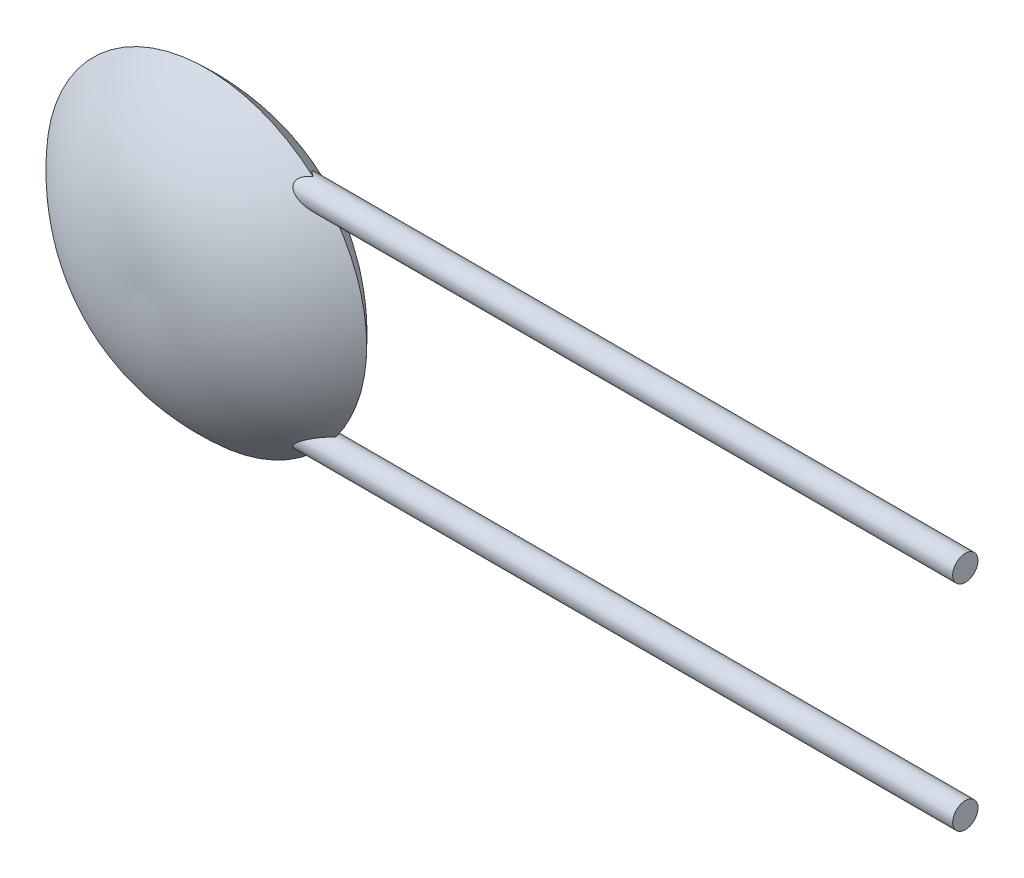
ISO-10303-21;
HEADER;
FILE_DESCRIPTION(('STEP AP214'),'2;1');
FILE_NAME('part.step','',(''),(''),'','','');
FILE_SCHEMA(('AUTOMOTIVE_DESIGN { 1 0 10303 214 1 1 1 1 }'));
ENDSEC;
DATA;
#1=APPLICATION_CONTEXT('core data for automotive mechanical design processes');
#2=APPLICATION_PROTOCOL_DEFINITION('international standard','automotive_design',2000,#1);
#3=PRODUCT_CONTEXT('',#1,'mechanical');
#4=PRODUCT('Part','Part','',(#3));
#5=PRODUCT_RELATED_PRODUCT_CATEGORY('part','',(#4));
#6=PRODUCT_DEFINITION_FORMATION('','',#4);
#7=PRODUCT_DEFINITION_CONTEXT('part definition',#1,'design');
#8=PRODUCT_DEFINITION('design','',#6,#7);
#9=PRODUCT_DEFINITION_SHAPE('','',#8);
#10=(LENGTH_UNIT() NAMED_UNIT(*) SI_UNIT(.MILLI.,.METRE.));
#11=(NAMED_UNIT(*) PLANE_ANGLE_UNIT() SI_UNIT($,.RADIAN.));
#12=(NAMED_UNIT(*) SI_UNIT($,.STERADIAN.) SOLID_ANGLE_UNIT());
#13=UNCERTAINTY_MEASURE_WITH_UNIT(LENGTH_MEASURE(1.E-05),#10,'distance_accuracy_value','');
#14=(GEOMETRIC_REPRESENTATION_CONTEXT(3) GLOBAL_UNCERTAINTY_ASSIGNED_CONTEXT((#13)) GLOBAL_UNIT_ASSIGNED_CONTEXT((#10,
#11,#12)) REPRESENTATION_CONTEXT('',''));
#15=CARTESIAN_POINT('',(0.,0.,0.));
#16=DIRECTION('',(0.,0.,1.));
#17=DIRECTION('',(1.,0.,0.));
#18=AXIS2_PLACEMENT_3D('',#15,#16,#17);
#19=CARTESIAN_POINT('',(0.,0.,0.8));
#20=CARTESIAN_POINT('',(1.1068824224434,0.,0.865042618922796));
#21=CARTESIAN_POINT('',(1.9,0.,0.));
#22=B_SPLINE_CURVE_WITH_KNOTS('',2,(#19,#20,#21),.UNSPECIFIED.,.F.,.F.,(3,3),(0.,1.),.UNSPECIFIED.);
#23=CARTESIAN_POINT('',(0.,0.,0.8));
#24=DIRECTION('',(0.,0.,1.));
#25=AXIS1_PLACEMENT('',#23,#24);
#26=SURFACE_OF_REVOLUTION('',#22,#25);
#27=CARTESIAN_POINT('',(1.53479640343597,-1.12,0.));
#28=CARTESIAN_POINT('',(1.52740638330839,-1.12000566612149,0.0065074062679365));
#29=CARTESIAN_POINT('',(1.51986000846679,-1.12042288590891,0.0128173819270295));
#30=CARTESIAN_POINT('',(1.50453898059812,-1.12197439928715,0.0250326227148049));
#31=CARTESIAN_POINT('',(1.49676478457888,-1.12310734002077,0.0309386281380667));
#32=CARTESIAN_POINT('',(1.47320974294176,-1.12741920008221,0.0480527645122609));
#33=CARTESIAN_POINT('',(1.45717168800999,-1.13151186926935,0.058678392963716));
#34=CARTESIAN_POINT('',(1.41816285082114,-1.14368367219915,0.0823864452400619));
#35=CARTESIAN_POINT('',(1.39502994735629,-1.15270764999625,0.0947058179390706));
#36=CARTESIAN_POINT('',(1.3486773992981,-1.17391225142004,0.116170770933312));
#37=CARTESIAN_POINT('',(1.32545767671567,-1.18609757651161,0.12531157636326));
#38=CARTESIAN_POINT('',(1.28975154946782,-1.20753786199314,0.136652120630259));
#39=CARTESIAN_POINT('',(1.27702643771841,-1.21573225964179,0.140137554299306));
#40=CARTESIAN_POINT('',(1.25202011252985,-1.23318975221472,0.14570295701662));
#41=CARTESIAN_POINT('',(1.23973800238448,-1.24245050830825,0.147785935799655));
#42=CARTESIAN_POINT('',(1.22025864456175,-1.2587127064149,0.149711275037536));
#43=CARTESIAN_POINT('',(1.21280934775998,-1.26534292718341,0.150087632642455));
#44=CARTESIAN_POINT('',(1.19851260339683,-1.27919535713052,0.149878038512571));
#45=CARTESIAN_POINT('',(1.19166425725663,-1.28641665013373,0.149293550242792));
#46=CARTESIAN_POINT('',(1.17751115625268,-1.30326215129572,0.146570149190876));
#47=CARTESIAN_POINT('',(1.17044664622052,-1.31306263986669,0.144112938682783));
#48=CARTESIAN_POINT('',(1.16083584259385,-1.3310479200157,0.137257775183314));
#49=CARTESIAN_POINT('',(1.1576123226858,-1.33905659929327,0.133466500397057));
#50=CARTESIAN_POINT('',(1.15501310548141,-1.35083009355637,0.126444002063828));
#51=CARTESIAN_POINT('',(1.15452325789862,-1.35473707755625,0.1238612285948));
#52=CARTESIAN_POINT('',(1.15436108753504,-1.36230149885185,0.118331550976894));
#53=CARTESIAN_POINT('',(1.15468853635081,-1.36595900557356,0.115384748779051));
#54=CARTESIAN_POINT('',(1.1566602394166,-1.37541623010942,0.107008834471892));
#55=CARTESIAN_POINT('',(1.15908943261749,-1.38083763628564,0.101334030033133));
#56=CARTESIAN_POINT('',(1.16733933341453,-1.39290469930388,0.086768964696163));
#57=CARTESIAN_POINT('',(1.17428530620215,-1.39861713500541,0.0778056009839755));
#58=CARTESIAN_POINT('',(1.1888437324668,-1.40704769943727,0.0615640442472039));
#59=CARTESIAN_POINT('',(1.1962458578947,-1.410062328654,0.0542199495699195));
#60=CARTESIAN_POINT('',(1.21180725891795,-1.41479816888227,0.0398783757020995));
#61=CARTESIAN_POINT('',(1.21996893199121,-1.41651511679705,0.0328821088898597));
#62=CARTESIAN_POINT('',(1.23388384421988,-1.41851407819609,0.0215536430297383));
#63=CARTESIAN_POINT('',(1.23951996427801,-1.41908483762997,0.0171194387800346));
#64=CARTESIAN_POINT('',(1.25088211627522,-1.4198247541265,0.00843561951156796));
#65=CARTESIAN_POINT('',(1.25660695380814,-1.4199973318003,0.00418474248092215));
#66=CARTESIAN_POINT('',(1.26237870704476,-1.42,0.));
#67=B_SPLINE_CURVE_WITH_KNOTS('',3,(#27,#28,#29,#30,#31,#32,#33,#34,#35,#36,#37,#38,#39,#40,#41,
#42,#43,#44,#45,#46,#47,#48,#49,#50,#51,#52,#53,#54,#55,#56,#57,#58,#59,#60,#61,#62,#63,#64,#65,
#66),.UNSPECIFIED.,.F.,.F.,(4,2,2,2,2,2,2,2,2,2,2,2,2,2,2,2,2,2,2,4),(0.,0.0295086285621638,
0.0589616460644433,0.117770672312027,0.20054194221167,0.283437019908039,0.329955837067183,
0.376374501693803,0.406248157490615,0.436076354844261,0.472573007761942,0.500317896389298,
0.514357612551909,0.528393405583865,0.552644703534187,0.590061819684776,0.622520061817714,
0.655084476614988,0.676655251835764,0.698040020424746),.UNSPECIFIED.);
#68=CARTESIAN_POINT('',(1.53479640343597,-1.12,0.));
#69=VERTEX_POINT('',#68);
#70=CARTESIAN_POINT('',(1.26237870704476,-1.42,0.));
#71=VERTEX_POINT('',#70);
#72=EDGE_CURVE('E57',#69,#71,#67,.T.);
#73=ORIENTED_EDGE('',*,*,#72,.F.);
#74=CARTESIAN_POINT('',(0.,0.,0.));
#75=DIRECTION('',(0.,0.,1.));
#76=DIRECTION('',(1.,0.,0.));
#77=AXIS2_PLACEMENT_3D('',#74,#75,#76);
#78=CIRCLE('',#77,1.9);
#79=CARTESIAN_POINT('',(1.53479640343597,1.12,0.));
#80=VERTEX_POINT('',#79);
#81=EDGE_CURVE('E63',#69,#80,#78,.T.);
#82=ORIENTED_EDGE('',*,*,#81,.T.);
#83=CARTESIAN_POINT('',(1.26237870704476,1.42,0.));
#84=CARTESIAN_POINT('',(1.25559554328648,1.41999456857551,0.00492014304322731));
#85=CARTESIAN_POINT('',(1.24886970762576,1.41975740287291,0.00993421966047264));
#86=CARTESIAN_POINT('',(1.23556192541091,1.41872449201915,0.0202082463031816));
#87=CARTESIAN_POINT('',(1.22898170696337,1.41792397512433,0.0254699358215006));
#88=CARTESIAN_POINT('',(1.21595925822409,1.41563907590765,0.0363422642912012));
#89=CARTESIAN_POINT('',(1.20952413111667,1.41413874011752,0.0419582475639488));
#90=CARTESIAN_POINT('',(1.19714961188435,1.41029768483243,0.0534142821507368));
#91=CARTESIAN_POINT('',(1.19120842996456,1.4079601784116,0.0592534015530102));
#92=CARTESIAN_POINT('',(1.18227056115896,1.4033363219247,0.0688290734417638));
#93=CARTESIAN_POINT('',(1.17903009981591,1.40138652442266,0.0724961556948264));
#94=CARTESIAN_POINT('',(1.17295662528676,1.39703793629623,0.0798744350920318));
#95=CARTESIAN_POINT('',(1.17012267087455,1.39464021346402,0.0835855080615008));
#96=CARTESIAN_POINT('',(1.16237976078778,1.38657257970906,0.0948433991124044));
#97=CARTESIAN_POINT('',(1.15828568791038,1.38005219855925,0.102458852283055));
#98=CARTESIAN_POINT('',(1.1545123164726,1.36661785740952,0.115012618858554));
#99=CARTESIAN_POINT('',(1.15402965039451,1.36014548046835,0.120162304690582));
#100=CARTESIAN_POINT('',(1.15555122268415,1.34667108909001,0.129181295184458));
#101=CARTESIAN_POINT('',(1.15755253988744,1.33966970585105,0.133052097040571));
#102=CARTESIAN_POINT('',(1.16461770774681,1.32279914266895,0.140834211399396));
#103=CARTESIAN_POINT('',(1.17064418950505,1.31303015485819,0.14400727531509));
#104=CARTESIAN_POINT('',(1.18333671740995,1.29599916162874,0.147946629858573));
#105=CARTESIAN_POINT('',(1.18974662585537,1.28858601196005,0.149016518619155));
#106=CARTESIAN_POINT('',(1.20330415041008,1.27435985803356,0.150104668376617));
#107=CARTESIAN_POINT('',(1.21045349290297,1.26754833035678,0.150120410056666));
#108=CARTESIAN_POINT('',(1.23175186665262,1.24863119501396,0.148991880910216));
#109=CARTESIAN_POINT('',(1.24645426704763,1.23722519405455,0.146799966108512));
#110=CARTESIAN_POINT('',(1.2765245037781,1.21596142914636,0.140364496724396));
#111=CARTESIAN_POINT('',(1.2918945265281,1.20610933250628,0.136113652302502));
#112=CARTESIAN_POINT('',(1.33047965548925,1.18336046981102,0.123438551638914));
#113=CARTESIAN_POINT('',(1.35386833322896,1.17131911635971,0.113990004751175));
#114=CARTESIAN_POINT('',(1.40047591522006,1.15048957621869,0.0919045290188739));
#115=CARTESIAN_POINT('',(1.42369512614219,1.14169052100626,0.079278495497347));
#116=CARTESIAN_POINT('',(1.4617746841807,1.13031411422238,0.0556532339404272));
#117=CARTESIAN_POINT('',(1.47683797986609,1.12664036536119,0.0455178960143255));
#118=CARTESIAN_POINT('',(1.49898048167156,1.12277634511889,0.02926287475906));
#119=CARTESIAN_POINT('',(1.50629635444251,1.12176249861861,0.0236601623323586));
#120=CARTESIAN_POINT('',(1.52072056360673,1.12037609316532,0.0120970829699083));
#121=CARTESIAN_POINT('',(1.52782854679989,1.12000456960071,0.00613615458173547));
#122=CARTESIAN_POINT('',(1.53479640343598,1.12,0.));
#123=B_SPLINE_CURVE_WITH_KNOTS('',3,(#83,#84,#85,#86,#87,#88,#89,#90,#91,#92,#93,#94,#95,#96,
#97,#98,#99,#100,#101,#102,#103,#104,#105,#106,#107,#108,#109,#110,#111,#112,#113,#114,#115,
#116,#117,#118,#119,#120,#121,#122),.UNSPECIFIED.,.F.,.F.,(4,2,2,2,2,2,2,2,2,2,2,2,2,2,2,2,2,2,
2,4),(0.,0.0251485981372747,0.0505128166516164,0.0764858469797419,0.102360242266352,
0.118129487907766,0.133861610751632,0.165567818083075,0.189924495773234,0.214252557129182,
0.249333182409598,0.278807338128121,0.308351931923458,0.364259945127059,0.420367369285465,
0.503812419271596,0.586975151788144,0.642377011123764,0.670159947822607,0.697987627439794),.UNSPECIFIED.);
#124=CARTESIAN_POINT('',(1.26237870704476,1.42,0.));
#125=VERTEX_POINT('',#124);
#126=EDGE_CURVE('E88',#125,#80,#123,.T.);
#127=ORIENTED_EDGE('',*,*,#126,.F.);
#128=EDGE_CURVE('E81',#125,#71,#78,.T.);
#129=ORIENTED_EDGE('',*,*,#128,.T.);
#130=EDGE_LOOP('',(#73,#82,#127,#129));
#131=FACE_BOUND('',#130,.T.);
#132=CARTESIAN_POINT('',(0.,0.,0.8));
#133=VERTEX_POINT('',#132);
#134=VERTEX_LOOP('',#133);
#135=FACE_BOUND('',#134,.T.);
#136=ADVANCED_FACE('F37',(#131,#135),#26,.F.);
#137=CARTESIAN_POINT('',(0.,0.,-0.8));
#138=CARTESIAN_POINT('',(1.1068824224434,0.,-0.865042618922796));
#139=CARTESIAN_POINT('',(1.9,0.,0.));
#140=B_SPLINE_CURVE_WITH_KNOTS('',2,(#137,#138,#139),.UNSPECIFIED.,.F.,.F.,(3,3),(0.,1.),.UNSPECIFIED.);
#141=CARTESIAN_POINT('',(0.,0.,0.8));
#142=DIRECTION('',(0.,0.,1.));
#143=AXIS1_PLACEMENT('',#141,#142);
#144=SURFACE_OF_REVOLUTION('',#140,#143);
#145=ORIENTED_EDGE('',*,*,#81,.F.);
#146=CARTESIAN_POINT('',(1.53479640343597,-1.12,0.));
#147=CARTESIAN_POINT('',(1.52740638330839,-1.12000566612149,-0.0065074062679365));
#148=CARTESIAN_POINT('',(1.51986000846679,-1.12042288590891,-0.0128173819270295));
#149=CARTESIAN_POINT('',(1.50453898059812,-1.12197439928715,-0.0250326227148049));
#150=CARTESIAN_POINT('',(1.49676478457888,-1.12310734002077,-0.0309386281380667));
#151=CARTESIAN_POINT('',(1.47320974294176,-1.12741920008221,-0.0480527645122609));
#152=CARTESIAN_POINT('',(1.45717168800999,-1.13151186926935,-0.058678392963716));
#153=CARTESIAN_POINT('',(1.41816285082114,-1.14368367219915,-0.0823864452400619));
#154=CARTESIAN_POINT('',(1.39502994735629,-1.15270764999625,-0.0947058179390706));
#155=CARTESIAN_POINT('',(1.3486773992981,-1.17391225142004,-0.116170770933312));
#156=CARTESIAN_POINT('',(1.32545767671567,-1.18609757651161,-0.12531157636326));
#157=CARTESIAN_POINT('',(1.28975154946782,-1.20753786199314,-0.136652120630259));
#158=CARTESIAN_POINT('',(1.27702643771841,-1.21573225964179,-0.140137554299306));
#159=CARTESIAN_POINT('',(1.25202011252985,-1.23318975221472,-0.14570295701662));
#160=CARTESIAN_POINT('',(1.23973800238448,-1.24245050830825,-0.147785935799655));
#161=CARTESIAN_POINT('',(1.22025864456175,-1.2587127064149,-0.149711275037536));
#162=CARTESIAN_POINT('',(1.21280934775998,-1.26534292718341,-0.150087632642455));
#163=CARTESIAN_POINT('',(1.19851260339683,-1.27919535713052,-0.149878038512571));
#164=CARTESIAN_POINT('',(1.19166425725663,-1.28641665013373,-0.149293550242792));
#165=CARTESIAN_POINT('',(1.17751115625268,-1.30326215129572,-0.146570149190876));
#166=CARTESIAN_POINT('',(1.17044664622052,-1.31306263986669,-0.144112938682783));
#167=CARTESIAN_POINT('',(1.16083584259385,-1.3310479200157,-0.137257775183314));
#168=CARTESIAN_POINT('',(1.1576123226858,-1.33905659929327,-0.133466500397057));
#169=CARTESIAN_POINT('',(1.15501310548141,-1.35083009355637,-0.126444002063828));
#170=CARTESIAN_POINT('',(1.15452325789862,-1.35473707755625,-0.1238612285948));
#171=CARTESIAN_POINT('',(1.15436108753504,-1.36230149885185,-0.118331550976894));
#172=CARTESIAN_POINT('',(1.15468853635081,-1.36595900557356,-0.115384748779051));
#173=CARTESIAN_POINT('',(1.1566602394166,-1.37541623010942,-0.107008834471892));
#174=CARTESIAN_POINT('',(1.15908943261749,-1.38083763628564,-0.101334030033133));
#175=CARTESIAN_POINT('',(1.16733933341453,-1.39290469930388,-0.086768964696163));
#176=CARTESIAN_POINT('',(1.17428530620215,-1.39861713500541,-0.0778056009839755));
#177=CARTESIAN_POINT('',(1.1888437324668,-1.40704769943727,-0.0615640442472039));
#178=CARTESIAN_POINT('',(1.1962458578947,-1.410062328654,-0.0542199495699195));
#179=CARTESIAN_POINT('',(1.21180725891795,-1.41479816888227,-0.0398783757020995));
#180=CARTESIAN_POINT('',(1.21996893199121,-1.41651511679705,-0.0328821088898597));
#181=CARTESIAN_POINT('',(1.23388384421988,-1.41851407819609,-0.0215536430297383));
#182=CARTESIAN_POINT('',(1.23951996427801,-1.41908483762997,-0.0171194387800346));
#183=CARTESIAN_POINT('',(1.25088211627522,-1.4198247541265,-0.00843561951156796));
#184=CARTESIAN_POINT('',(1.25660695380814,-1.4199973318003,-0.00418474248092215));
#185=CARTESIAN_POINT('',(1.26237870704476,-1.42,0.));
#186=B_SPLINE_CURVE_WITH_KNOTS('',3,(#146,#147,#148,#149,#150,#151,#152,#153,#154,#155,#156,
#157,#158,#159,#160,#161,#162,#163,#164,#165,#166,#167,#168,#169,#170,#171,#172,#173,#174,#175,
#176,#177,#178,#179,#180,#181,#182,#183,#184,#185),.UNSPECIFIED.,.F.,.F.,(4,2,2,2,2,2,2,2,2,2,2,
2,2,2,2,2,2,2,2,4),(0.,0.0295086285621638,0.0589616460644433,0.117770672312027,0.20054194221167,
0.283437019908039,0.329955837067183,0.376374501693803,0.406248157490615,0.436076354844261,
0.472573007761942,0.500317896389298,0.514357612551909,0.528393405583865,0.552644703534187,
0.590061819684776,0.622520061817714,0.655084476614988,0.676655251835764,0.698040020424746),.UNSPECIFIED.);
#187=EDGE_CURVE('E11',#69,#71,#186,.T.);
#188=ORIENTED_EDGE('',*,*,#187,.T.);
#189=ORIENTED_EDGE('',*,*,#128,.F.);
#190=CARTESIAN_POINT('',(1.26237870704476,1.42,0.));
#191=CARTESIAN_POINT('',(1.25559554328648,1.41999456857551,-0.00492014304322731));
#192=CARTESIAN_POINT('',(1.24886970762576,1.41975740287291,-0.00993421966047264));
#193=CARTESIAN_POINT('',(1.23556192541091,1.41872449201915,-0.0202082463031816));
#194=CARTESIAN_POINT('',(1.22898170696337,1.41792397512433,-0.0254699358215006));
#195=CARTESIAN_POINT('',(1.21595925822409,1.41563907590765,-0.0363422642912012));
#196=CARTESIAN_POINT('',(1.20952413111667,1.41413874011752,-0.0419582475639488));
#197=CARTESIAN_POINT('',(1.19714961188435,1.41029768483243,-0.0534142821507368));
#198=CARTESIAN_POINT('',(1.19120842996456,1.4079601784116,-0.0592534015530102));
#199=CARTESIAN_POINT('',(1.18227056115896,1.4033363219247,-0.0688290734417638));
#200=CARTESIAN_POINT('',(1.17903009981591,1.40138652442266,-0.0724961556948264));
#201=CARTESIAN_POINT('',(1.17295662528676,1.39703793629623,-0.0798744350920318));
#202=CARTESIAN_POINT('',(1.17012267087455,1.39464021346402,-0.0835855080615008));
#203=CARTESIAN_POINT('',(1.16237976078778,1.38657257970906,-0.0948433991124044));
#204=CARTESIAN_POINT('',(1.15828568791038,1.38005219855925,-0.102458852283055));
#205=CARTESIAN_POINT('',(1.1545123164726,1.36661785740952,-0.115012618858554));
#206=CARTESIAN_POINT('',(1.15402965039451,1.36014548046835,-0.120162304690582));
#207=CARTESIAN_POINT('',(1.15555122268415,1.34667108909001,-0.129181295184458));
#208=CARTESIAN_POINT('',(1.15755253988744,1.33966970585105,-0.133052097040571));
#209=CARTESIAN_POINT('',(1.16461770774681,1.32279914266895,-0.140834211399396));
#210=CARTESIAN_POINT('',(1.17064418950505,1.31303015485819,-0.14400727531509));
#211=CARTESIAN_POINT('',(1.18333671740995,1.29599916162874,-0.147946629858573));
#212=CARTESIAN_POINT('',(1.18974662585537,1.28858601196005,-0.149016518619155));
#213=CARTESIAN_POINT('',(1.20330415041008,1.27435985803356,-0.150104668376617));
#214=CARTESIAN_POINT('',(1.21045349290297,1.26754833035678,-0.150120410056666));
#215=CARTESIAN_POINT('',(1.23175186665262,1.24863119501396,-0.148991880910216));
#216=CARTESIAN_POINT('',(1.24645426704763,1.23722519405455,-0.146799966108512));
#217=CARTESIAN_POINT('',(1.2765245037781,1.21596142914636,-0.140364496724396));
#218=CARTESIAN_POINT('',(1.2918945265281,1.20610933250628,-0.136113652302502));
#219=CARTESIAN_POINT('',(1.33047965548925,1.18336046981102,-0.123438551638914));
#220=CARTESIAN_POINT('',(1.35386833322896,1.17131911635971,-0.113990004751175));
#221=CARTESIAN_POINT('',(1.40047591522006,1.15048957621869,-0.0919045290188739));
#222=CARTESIAN_POINT('',(1.42369512614219,1.14169052100626,-0.079278495497347));
#223=CARTESIAN_POINT('',(1.4617746841807,1.13031411422238,-0.0556532339404272));
#224=CARTESIAN_POINT('',(1.47683797986609,1.12664036536119,-0.0455178960143255));
#225=CARTESIAN_POINT('',(1.49898048167156,1.12277634511889,-0.02926287475906));
#226=CARTESIAN_POINT('',(1.50629635444251,1.12176249861861,-0.0236601623323586));
#227=CARTESIAN_POINT('',(1.52072056360673,1.12037609316532,-0.0120970829699083));
#228=CARTESIAN_POINT('',(1.52782854679989,1.12000456960071,-0.00613615458173547));
#229=CARTESIAN_POINT('',(1.53479640343598,1.12,0.));
#230=B_SPLINE_CURVE_WITH_KNOTS('',3,(#190,#191,#192,#193,#194,#195,#196,#197,#198,#199,#200,
#201,#202,#203,#204,#205,#206,#207,#208,#209,#210,#211,#212,#213,#214,#215,#216,#217,#218,#219,
#220,#221,#222,#223,#224,#225,#226,#227,#228,#229),.UNSPECIFIED.,.F.,.F.,(4,2,2,2,2,2,2,2,2,2,2,
2,2,2,2,2,2,2,2,4),(0.,0.0251485981372747,0.0505128166516164,0.0764858469797419,
0.102360242266352,0.118129487907766,0.133861610751632,0.165567818083075,0.189924495773234,
0.214252557129182,0.249333182409598,0.278807338128121,0.308351931923458,0.364259945127059,
0.420367369285465,0.503812419271596,0.586975151788144,0.642377011123764,0.670159947822607,
0.697987627439794),.UNSPECIFIED.);
#231=EDGE_CURVE('E51',#125,#80,#230,.T.);
#232=ORIENTED_EDGE('',*,*,#231,.T.);
#233=EDGE_LOOP('',(#145,#188,#189,#232));
#234=FACE_BOUND('',#233,.T.);
#235=CARTESIAN_POINT('',(0.,0.,-0.8));
#236=VERTEX_POINT('',#235);
#237=VERTEX_LOOP('',#236);
#238=FACE_BOUND('',#237,.T.);
#239=ADVANCED_FACE('F86',(#234,#238),#144,.T.);
#240=CARTESIAN_POINT('',(9.,1.27,0.));
#241=DIRECTION('',(1.,0.,0.));
#242=DIRECTION('',(0.,0.,-1.));
#243=AXIS2_PLACEMENT_3D('',#240,#241,#242);
#244=PLANE('',#243);
#245=CARTESIAN_POINT('',(9.,1.27,0.));
#246=DIRECTION('',(1.,0.,0.));
#247=DIRECTION('',(0.,0.,-1.));
#248=AXIS2_PLACEMENT_3D('',#245,#246,#247);
#249=CIRCLE('',#248,0.15);
#250=CARTESIAN_POINT('',(9.,1.27,-0.15));
#251=VERTEX_POINT('',#250);
#252=EDGE_CURVE('E82',#251,#251,#249,.T.);
#253=ORIENTED_EDGE('',*,*,#252,.T.);
#254=EDGE_LOOP('',(#253));
#255=FACE_BOUND('',#254,.T.);
#256=ADVANCED_FACE('F107',(#255),#244,.T.);
#257=CARTESIAN_POINT('',(0.,1.27,0.));
#258=DIRECTION('',(1.,0.,0.));
#259=DIRECTION('',(0.,0.,-1.));
#260=AXIS2_PLACEMENT_3D('',#257,#258,#259);
#261=CYLINDRICAL_SURFACE('',#260,0.15);
#262=ORIENTED_EDGE('',*,*,#231,.F.);
#263=ORIENTED_EDGE('',*,*,#126,.T.);
#264=EDGE_LOOP('',(#262,#263));
#265=FACE_BOUND('',#264,.T.);
#266=ORIENTED_EDGE('',*,*,#252,.F.);
#267=EDGE_LOOP('',(#266));
#268=FACE_BOUND('',#267,.T.);
#269=ADVANCED_FACE('F102',(#265,#268),#261,.T.);
#270=CARTESIAN_POINT('',(9.,-1.27,0.));
#271=DIRECTION('',(1.,0.,0.));
#272=DIRECTION('',(0.,0.,-1.));
#273=AXIS2_PLACEMENT_3D('',#270,#271,#272);
#274=PLANE('',#273);
#275=CARTESIAN_POINT('',(9.,-1.27,0.));
#276=DIRECTION('',(-1.,0.,0.));
#277=DIRECTION('',(0.,0.,-1.));
#278=AXIS2_PLACEMENT_3D('',#275,#276,#277);
#279=CIRCLE('',#278,0.15);
#280=CARTESIAN_POINT('',(9.,-1.27,-0.15));
#281=VERTEX_POINT('',#280);
#282=EDGE_CURVE('E83',#281,#281,#279,.F.);
#283=ORIENTED_EDGE('',*,*,#282,.T.);
#284=EDGE_LOOP('',(#283));
#285=FACE_BOUND('',#284,.T.);
#286=ADVANCED_FACE('F106',(#285),#274,.T.);
#287=CARTESIAN_POINT('',(0.,-1.27,0.));
#288=DIRECTION('',(1.,0.,0.));
#289=DIRECTION('',(0.,0.,-1.));
#290=AXIS2_PLACEMENT_3D('',#287,#288,#289);
#291=CYLINDRICAL_SURFACE('',#290,0.15);
#292=ORIENTED_EDGE('',*,*,#187,.F.);
#293=ORIENTED_EDGE('',*,*,#72,.T.);
#294=EDGE_LOOP('',(#292,#293));
#295=FACE_BOUND('',#294,.T.);
#296=ORIENTED_EDGE('',*,*,#282,.F.);
#297=EDGE_LOOP('',(#296));
#298=FACE_BOUND('',#297,.T.);
#299=ADVANCED_FACE('F75',(#295,#298),#291,.T.);
#300=CLOSED_SHELL('',(#136,#239,#256,#269,#286,#299));
#301=MANIFOLD_SOLID_BREP('B2',#300);
#302=ADVANCED_BREP_SHAPE_REPRESENTATION('',(#18,#301),#14);
#303=SHAPE_DEFINITION_REPRESENTATION(#9,#302);
ENDSEC;
END-ISO-10303-21;
